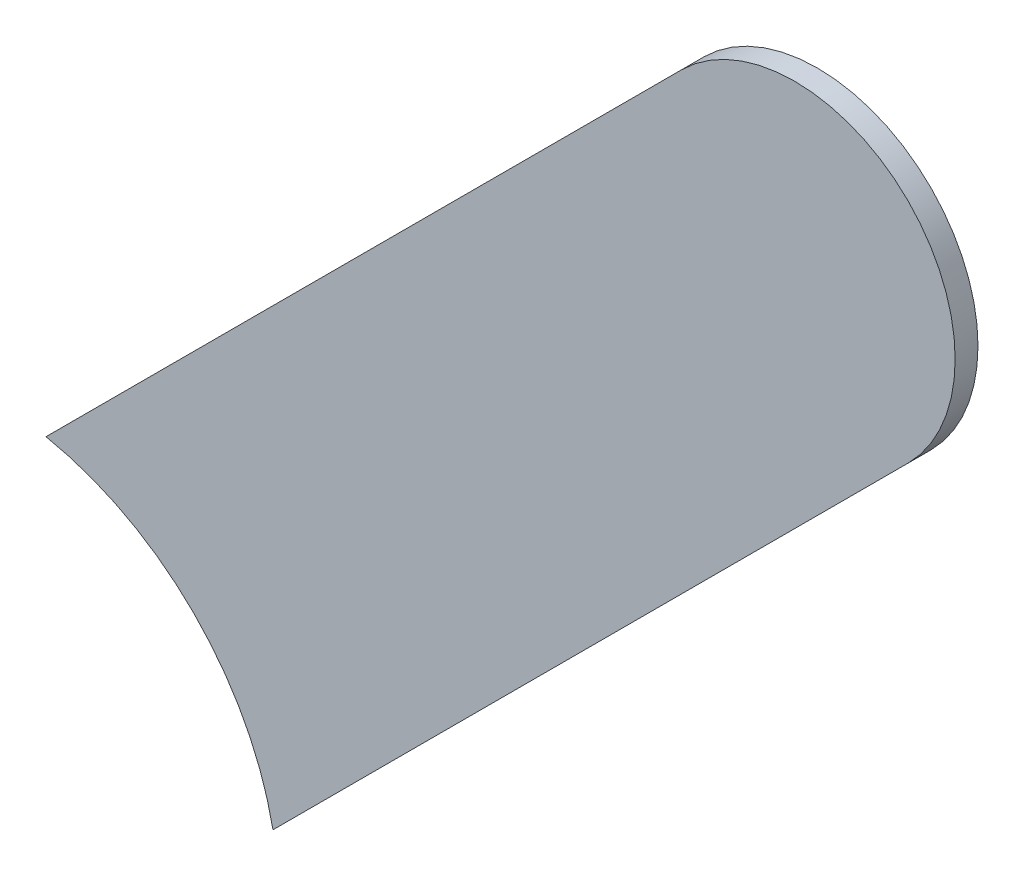
ISO-10303-21;
HEADER;
FILE_DESCRIPTION(('STEP AP214'),'2;1');
FILE_NAME('part.step','',(''),(''),'','','');
FILE_SCHEMA(('AUTOMOTIVE_DESIGN { 1 0 10303 214 1 1 1 1 }'));
ENDSEC;
DATA;
#1=APPLICATION_CONTEXT('core data for automotive mechanical design processes');
#2=APPLICATION_PROTOCOL_DEFINITION('international standard','automotive_design',2000,#1);
#3=PRODUCT_CONTEXT('',#1,'mechanical');
#4=PRODUCT('Part','Part','',(#3));
#5=PRODUCT_RELATED_PRODUCT_CATEGORY('part','',(#4));
#6=PRODUCT_DEFINITION_FORMATION('','',#4);
#7=PRODUCT_DEFINITION_CONTEXT('part definition',#1,'design');
#8=PRODUCT_DEFINITION('design','',#6,#7);
#9=PRODUCT_DEFINITION_SHAPE('','',#8);
#10=(LENGTH_UNIT() NAMED_UNIT(*) SI_UNIT(.MILLI.,.METRE.));
#11=(NAMED_UNIT(*) PLANE_ANGLE_UNIT() SI_UNIT($,.RADIAN.));
#12=(NAMED_UNIT(*) SI_UNIT($,.STERADIAN.) SOLID_ANGLE_UNIT());
#13=UNCERTAINTY_MEASURE_WITH_UNIT(LENGTH_MEASURE(1.E-05),#10,'distance_accuracy_value','');
#14=(GEOMETRIC_REPRESENTATION_CONTEXT(3) GLOBAL_UNCERTAINTY_ASSIGNED_CONTEXT((#13)) GLOBAL_UNIT_ASSIGNED_CONTEXT((#10,
#11,#12)) REPRESENTATION_CONTEXT('',''));
#15=CARTESIAN_POINT('',(0.,0.,0.));
#16=DIRECTION('',(0.,0.,1.));
#17=DIRECTION('',(1.,0.,0.));
#18=AXIS2_PLACEMENT_3D('',#15,#16,#17);
#19=CARTESIAN_POINT('',(91.7323545563948,106.955808996395,0.));
#20=DIRECTION('',(-0.707106781186543,0.707106781186552,0.));
#21=DIRECTION('',(0.707106781186552,0.707106781186543,0.));
#22=AXIS2_PLACEMENT_3D('',#19,#20,#21);
#23=PLANE('',#22);
#24=DIRECTION('',(0.707106781186552,0.707106781186543,0.));
#25=VECTOR('',#24,1.);
#26=CARTESIAN_POINT('',(91.46777998,106.69123442,0.03556));
#27=LINE('',#26,#25);
#28=CARTESIAN_POINT('',(91.7323545563948,106.955808996395,0.03556));
#29=VERTEX_POINT('',#28);
#30=CARTESIAN_POINT('',(92.72178052,107.94523496,0.03556));
#31=VERTEX_POINT('',#30);
#32=EDGE_CURVE('E11',#29,#31,#27,.T.);
#33=ORIENTED_EDGE('',*,*,#32,.F.);
#34=DIRECTION('',(0.,0.,1.));
#35=VECTOR('',#34,1.);
#36=CARTESIAN_POINT('',(91.7323545563948,106.955808996395,0.));
#37=LINE('',#36,#35);
#38=CARTESIAN_POINT('',(91.7323545563948,106.955808996395,0.));
#39=VERTEX_POINT('',#38);
#40=EDGE_CURVE('E24',#39,#29,#37,.T.);
#41=ORIENTED_EDGE('',*,*,#40,.F.);
#42=DIRECTION('',(0.707106781186552,0.707106781186543,0.));
#43=VECTOR('',#42,1.);
#44=CARTESIAN_POINT('',(91.46777998,106.69123442,0.));
#45=LINE('',#44,#43);
#46=CARTESIAN_POINT('',(92.72178052,107.94523496,0.));
#47=VERTEX_POINT('',#46);
#48=EDGE_CURVE('E75',#39,#47,#45,.T.);
#49=ORIENTED_EDGE('',*,*,#48,.T.);
#50=DIRECTION('',(0.,0.,1.));
#51=VECTOR('',#50,1.);
#52=CARTESIAN_POINT('',(92.72178052,107.94523496,0.));
#53=LINE('',#52,#51);
#54=EDGE_CURVE('E37',#47,#31,#53,.T.);
#55=ORIENTED_EDGE('',*,*,#54,.T.);
#56=EDGE_LOOP('',(#33,#41,#49,#55));
#57=FACE_BOUND('',#56,.T.);
#58=ADVANCED_FACE('F17',(#57),#23,.F.);
#59=CARTESIAN_POINT('',(92.54500414,108.12201134,0.));
#60=DIRECTION('',(0.,0.,-1.));
#61=DIRECTION('',(0.707106781186519,-0.707106781186576,0.));
#62=AXIS2_PLACEMENT_3D('',#59,#60,#61);
#63=CYLINDRICAL_SURFACE('',#62,0.249999554103223);
#64=CARTESIAN_POINT('',(92.54500414,108.12201134,0.03556));
#65=DIRECTION('',(0.,0.,1.));
#66=DIRECTION('',(0.707106781186519,-0.707106781186576,0.));
#67=AXIS2_PLACEMENT_3D('',#64,#65,#66);
#68=CIRCLE('',#67,0.249999554103223);
#69=CARTESIAN_POINT('',(92.36822776,108.29878772,0.03556));
#70=VERTEX_POINT('',#69);
#71=EDGE_CURVE('E83',#31,#70,#68,.T.);
#72=ORIENTED_EDGE('',*,*,#71,.F.);
#73=ORIENTED_EDGE('',*,*,#54,.F.);
#74=CARTESIAN_POINT('',(92.54500414,108.12201134,0.));
#75=DIRECTION('',(0.,0.,1.));
#76=DIRECTION('',(0.707106781186519,-0.707106781186576,0.));
#77=AXIS2_PLACEMENT_3D('',#74,#75,#76);
#78=CIRCLE('',#77,0.249999554103223);
#79=CARTESIAN_POINT('',(92.36822776,108.29878772,0.));
#80=VERTEX_POINT('',#79);
#81=EDGE_CURVE('E81',#47,#80,#78,.T.);
#82=ORIENTED_EDGE('',*,*,#81,.T.);
#83=DIRECTION('',(0.,0.,1.));
#84=VECTOR('',#83,1.);
#85=CARTESIAN_POINT('',(92.36822776,108.29878772,0.));
#86=LINE('',#85,#84);
#87=EDGE_CURVE('E67',#80,#70,#86,.T.);
#88=ORIENTED_EDGE('',*,*,#87,.T.);
#89=EDGE_LOOP('',(#72,#73,#82,#88));
#90=FACE_BOUND('',#89,.T.);
#91=ADVANCED_FACE('F89',(#90),#63,.T.);
#92=CARTESIAN_POINT('',(92.36822776,108.29878772,0.));
#93=DIRECTION('',(0.707106781186552,-0.707106781186543,0.));
#94=DIRECTION('',(-0.707106781186543,-0.707106781186552,0.));
#95=AXIS2_PLACEMENT_3D('',#92,#93,#94);
#96=PLANE('',#95);
#97=DIRECTION('',(-0.707106781186543,-0.707106781186552,0.));
#98=VECTOR('',#97,1.);
#99=CARTESIAN_POINT('',(92.36822776,108.29878772,0.03556));
#100=LINE('',#99,#98);
#101=CARTESIAN_POINT('',(91.3788017963948,107.309361756395,0.03556));
#102=VERTEX_POINT('',#101);
#103=EDGE_CURVE('E71',#70,#102,#100,.T.);
#104=ORIENTED_EDGE('',*,*,#103,.F.);
#105=ORIENTED_EDGE('',*,*,#87,.F.);
#106=DIRECTION('',(-0.707106781186543,-0.707106781186552,0.));
#107=VECTOR('',#106,1.);
#108=CARTESIAN_POINT('',(92.36822776,108.29878772,0.));
#109=LINE('',#108,#107);
#110=CARTESIAN_POINT('',(91.3788017963948,107.309361756395,0.));
#111=VERTEX_POINT('',#110);
#112=EDGE_CURVE('E63',#80,#111,#109,.T.);
#113=ORIENTED_EDGE('',*,*,#112,.T.);
#114=DIRECTION('',(0.,0.,1.));
#115=VECTOR('',#114,1.);
#116=CARTESIAN_POINT('',(91.3788017963948,107.309361756395,0.));
#117=LINE('',#116,#115);
#118=EDGE_CURVE('E53',#111,#102,#117,.T.);
#119=ORIENTED_EDGE('',*,*,#118,.T.);
#120=EDGE_LOOP('',(#104,#105,#113,#119));
#121=FACE_BOUND('',#120,.T.);
#122=ADVANCED_FACE('F66',(#121),#96,.F.);
#123=CARTESIAN_POINT('',(91.2910036,106.8680108,0.));
#124=DIRECTION('',(0.,0.,-1.));
#125=DIRECTION('',(1.,0.,0.));
#126=AXIS2_PLACEMENT_3D('',#123,#124,#125);
#127=CYLINDRICAL_SURFACE('',#126,0.4499991);
#128=ORIENTED_EDGE('',*,*,#40,.T.);
#129=CARTESIAN_POINT('',(91.2910036,106.8680108,0.03556));
#130=DIRECTION('',(0.,0.,1.));
#131=DIRECTION('',(1.,0.,0.));
#132=AXIS2_PLACEMENT_3D('',#129,#130,#131);
#133=CIRCLE('',#132,0.4499991);
#134=EDGE_CURVE('E59',#29,#102,#133,.T.);
#135=ORIENTED_EDGE('',*,*,#134,.T.);
#136=ORIENTED_EDGE('',*,*,#118,.F.);
#137=CARTESIAN_POINT('',(91.2910036,106.8680108,0.));
#138=DIRECTION('',(0.,0.,1.));
#139=DIRECTION('',(1.,0.,0.));
#140=AXIS2_PLACEMENT_3D('',#137,#138,#139);
#141=CIRCLE('',#140,0.4499991);
#142=EDGE_CURVE('E57',#39,#111,#141,.T.);
#143=ORIENTED_EDGE('',*,*,#142,.F.);
#144=EDGE_LOOP('',(#128,#135,#136,#143));
#145=FACE_BOUND('',#144,.T.);
#146=ADVANCED_FACE('F55',(#145),#127,.F.);
#147=CARTESIAN_POINT('',(91.46777998,106.69123442,0.));
#148=DIRECTION('',(0.,0.,-1.));
#149=DIRECTION('',(-1.,0.,0.));
#150=AXIS2_PLACEMENT_3D('',#147,#148,#149);
#151=PLANE('',#150);
#152=ORIENTED_EDGE('',*,*,#48,.F.);
#153=ORIENTED_EDGE('',*,*,#142,.T.);
#154=ORIENTED_EDGE('',*,*,#112,.F.);
#155=ORIENTED_EDGE('',*,*,#81,.F.);
#156=EDGE_LOOP('',(#152,#153,#154,#155));
#157=FACE_BOUND('',#156,.T.);
#158=ADVANCED_FACE('F74',(#157),#151,.T.);
#159=CARTESIAN_POINT('',(91.46777998,106.69123442,0.03556));
#160=DIRECTION('',(0.,0.,-1.));
#161=DIRECTION('',(-1.,0.,0.));
#162=AXIS2_PLACEMENT_3D('',#159,#160,#161);
#163=PLANE('',#162);
#164=ORIENTED_EDGE('',*,*,#134,.F.);
#165=ORIENTED_EDGE('',*,*,#32,.T.);
#166=ORIENTED_EDGE('',*,*,#71,.T.);
#167=ORIENTED_EDGE('',*,*,#103,.T.);
#168=EDGE_LOOP('',(#164,#165,#166,#167));
#169=FACE_BOUND('',#168,.T.);
#170=ADVANCED_FACE('F91',(#169),#163,.F.);
#171=CLOSED_SHELL('',(#58,#91,#122,#146,#158,#170));
#172=MANIFOLD_SOLID_BREP('B1',#171);
#173=ADVANCED_BREP_SHAPE_REPRESENTATION('',(#18,#172),#14);
#174=SHAPE_DEFINITION_REPRESENTATION(#9,#173);
ENDSEC;
END-ISO-10303-21;
